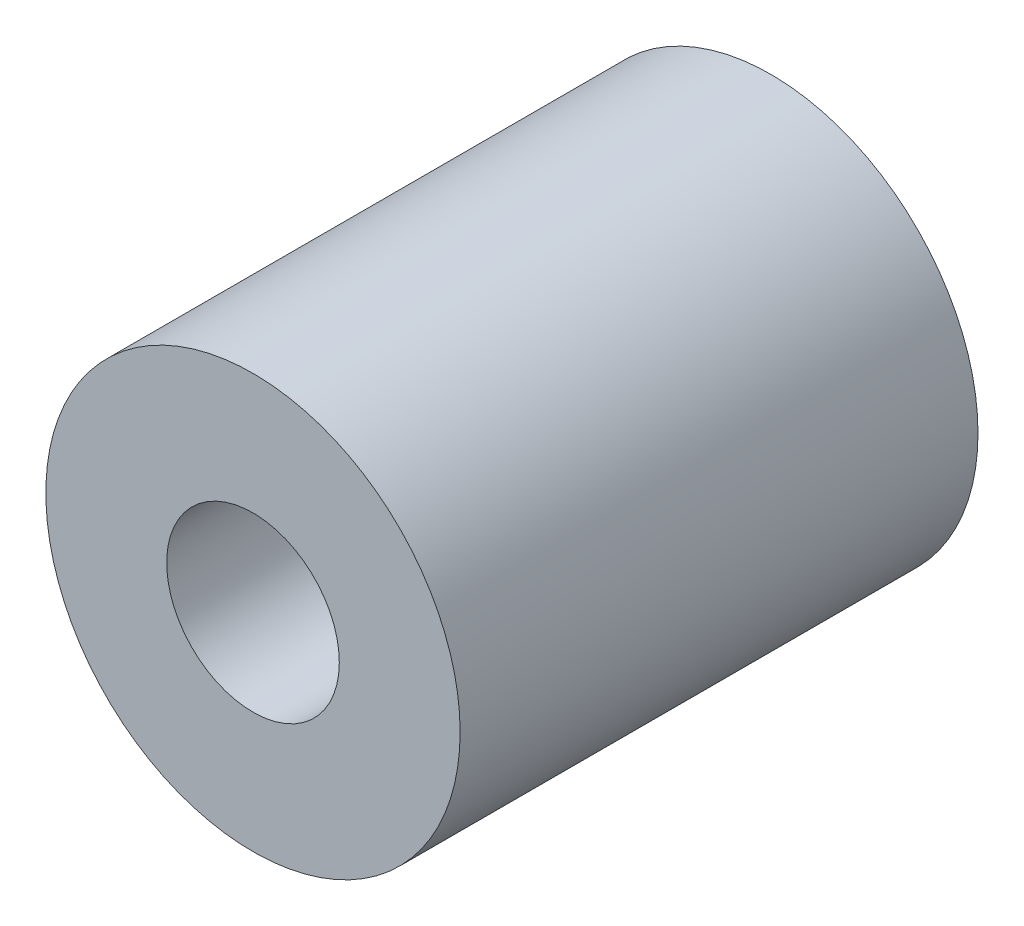
ISO-10303-21;
HEADER;
FILE_DESCRIPTION(('STEP AP214'),'2;1');
FILE_NAME('part.step','',(''),(''),'','','');
FILE_SCHEMA(('AUTOMOTIVE_DESIGN { 1 0 10303 214 1 1 1 1 }'));
ENDSEC;
DATA;
#1=APPLICATION_CONTEXT('core data for automotive mechanical design processes');
#2=APPLICATION_PROTOCOL_DEFINITION('international standard','automotive_design',2000,#1);
#3=PRODUCT_CONTEXT('',#1,'mechanical');
#4=PRODUCT('Part','Part','',(#3));
#5=PRODUCT_RELATED_PRODUCT_CATEGORY('part','',(#4));
#6=PRODUCT_DEFINITION_FORMATION('','',#4);
#7=PRODUCT_DEFINITION_CONTEXT('part definition',#1,'design');
#8=PRODUCT_DEFINITION('design','',#6,#7);
#9=PRODUCT_DEFINITION_SHAPE('','',#8);
#10=(LENGTH_UNIT() NAMED_UNIT(*) SI_UNIT(.MILLI.,.METRE.));
#11=(NAMED_UNIT(*) PLANE_ANGLE_UNIT() SI_UNIT($,.RADIAN.));
#12=(NAMED_UNIT(*) SI_UNIT($,.STERADIAN.) SOLID_ANGLE_UNIT());
#13=UNCERTAINTY_MEASURE_WITH_UNIT(LENGTH_MEASURE(1.E-05),#10,'distance_accuracy_value','');
#14=(GEOMETRIC_REPRESENTATION_CONTEXT(3) GLOBAL_UNCERTAINTY_ASSIGNED_CONTEXT((#13)) GLOBAL_UNIT_ASSIGNED_CONTEXT((#10,
#11,#12)) REPRESENTATION_CONTEXT('',''));
#15=CARTESIAN_POINT('',(0.,0.,0.));
#16=DIRECTION('',(0.,0.,1.));
#17=DIRECTION('',(1.,0.,0.));
#18=AXIS2_PLACEMENT_3D('',#15,#16,#17);
#19=CARTESIAN_POINT('',(0.,0.,30.));
#20=DIRECTION('',(0.,0.,1.));
#21=DIRECTION('',(1.,0.,0.));
#22=AXIS2_PLACEMENT_3D('',#19,#20,#21);
#23=PLANE('',#22);
#24=CARTESIAN_POINT('',(0.,0.,30.));
#25=DIRECTION('',(0.,0.,1.));
#26=DIRECTION('',(1.,0.,0.));
#27=AXIS2_PLACEMENT_3D('',#24,#25,#26);
#28=CIRCLE('',#27,12.);
#29=CARTESIAN_POINT('',(12.,0.,30.));
#30=VERTEX_POINT('',#29);
#31=EDGE_CURVE('E10',#30,#30,#28,.T.);
#32=ORIENTED_EDGE('',*,*,#31,.T.);
#33=EDGE_LOOP('',(#32));
#34=FACE_BOUND('',#33,.T.);
#35=CARTESIAN_POINT('',(0.,0.,30.));
#36=DIRECTION('',(0.,0.,1.));
#37=DIRECTION('',(1.,0.,0.));
#38=AXIS2_PLACEMENT_3D('',#35,#36,#37);
#39=CIRCLE('',#38,5.);
#40=CARTESIAN_POINT('',(5.,0.,30.));
#41=VERTEX_POINT('',#40);
#42=EDGE_CURVE('E47',#41,#41,#39,.T.);
#43=ORIENTED_EDGE('',*,*,#42,.F.);
#44=EDGE_LOOP('',(#43));
#45=FACE_BOUND('',#44,.T.);
#46=ADVANCED_FACE('F36',(#34,#45),#23,.T.);
#47=CARTESIAN_POINT('',(0.,0.,0.));
#48=DIRECTION('',(0.,0.,1.));
#49=DIRECTION('',(1.,0.,0.));
#50=AXIS2_PLACEMENT_3D('',#47,#48,#49);
#51=PLANE('',#50);
#52=CARTESIAN_POINT('',(0.,0.,0.));
#53=DIRECTION('',(0.,0.,1.));
#54=DIRECTION('',(1.,0.,0.));
#55=AXIS2_PLACEMENT_3D('',#52,#53,#54);
#56=CIRCLE('',#55,12.);
#57=CARTESIAN_POINT('',(12.,0.,0.));
#58=VERTEX_POINT('',#57);
#59=EDGE_CURVE('E40',#58,#58,#56,.T.);
#60=ORIENTED_EDGE('',*,*,#59,.F.);
#61=EDGE_LOOP('',(#60));
#62=FACE_BOUND('',#61,.T.);
#63=CARTESIAN_POINT('',(0.,0.,0.));
#64=DIRECTION('',(0.,0.,1.));
#65=DIRECTION('',(1.,0.,0.));
#66=AXIS2_PLACEMENT_3D('',#63,#64,#65);
#67=CIRCLE('',#66,5.);
#68=CARTESIAN_POINT('',(5.,0.,0.));
#69=VERTEX_POINT('',#68);
#70=EDGE_CURVE('E49',#69,#69,#67,.T.);
#71=ORIENTED_EDGE('',*,*,#70,.T.);
#72=EDGE_LOOP('',(#71));
#73=FACE_BOUND('',#72,.T.);
#74=ADVANCED_FACE('F59',(#62,#73),#51,.F.);
#75=CARTESIAN_POINT('',(0.,0.,30.));
#76=DIRECTION('',(0.,0.,-1.));
#77=DIRECTION('',(-1.,0.,0.));
#78=AXIS2_PLACEMENT_3D('',#75,#76,#77);
#79=CYLINDRICAL_SURFACE('',#78,12.);
#80=ORIENTED_EDGE('',*,*,#31,.F.);
#81=EDGE_LOOP('',(#80));
#82=FACE_BOUND('',#81,.T.);
#83=ORIENTED_EDGE('',*,*,#59,.T.);
#84=EDGE_LOOP('',(#83));
#85=FACE_BOUND('',#84,.T.);
#86=ADVANCED_FACE('F38',(#82,#85),#79,.T.);
#87=CARTESIAN_POINT('',(0.,0.,30.));
#88=DIRECTION('',(0.,0.,-1.));
#89=DIRECTION('',(-1.,0.,0.));
#90=AXIS2_PLACEMENT_3D('',#87,#88,#89);
#91=CYLINDRICAL_SURFACE('',#90,5.);
#92=ORIENTED_EDGE('',*,*,#42,.T.);
#93=EDGE_LOOP('',(#92));
#94=FACE_BOUND('',#93,.T.);
#95=ORIENTED_EDGE('',*,*,#70,.F.);
#96=EDGE_LOOP('',(#95));
#97=FACE_BOUND('',#96,.T.);
#98=ADVANCED_FACE('F55',(#94,#97),#91,.F.);
#99=CLOSED_SHELL('',(#46,#74,#86,#98));
#100=MANIFOLD_SOLID_BREP('B2',#99);
#101=ADVANCED_BREP_SHAPE_REPRESENTATION('',(#18,#100),#14);
#102=SHAPE_DEFINITION_REPRESENTATION(#9,#101);
ENDSEC;
END-ISO-10303-21;
